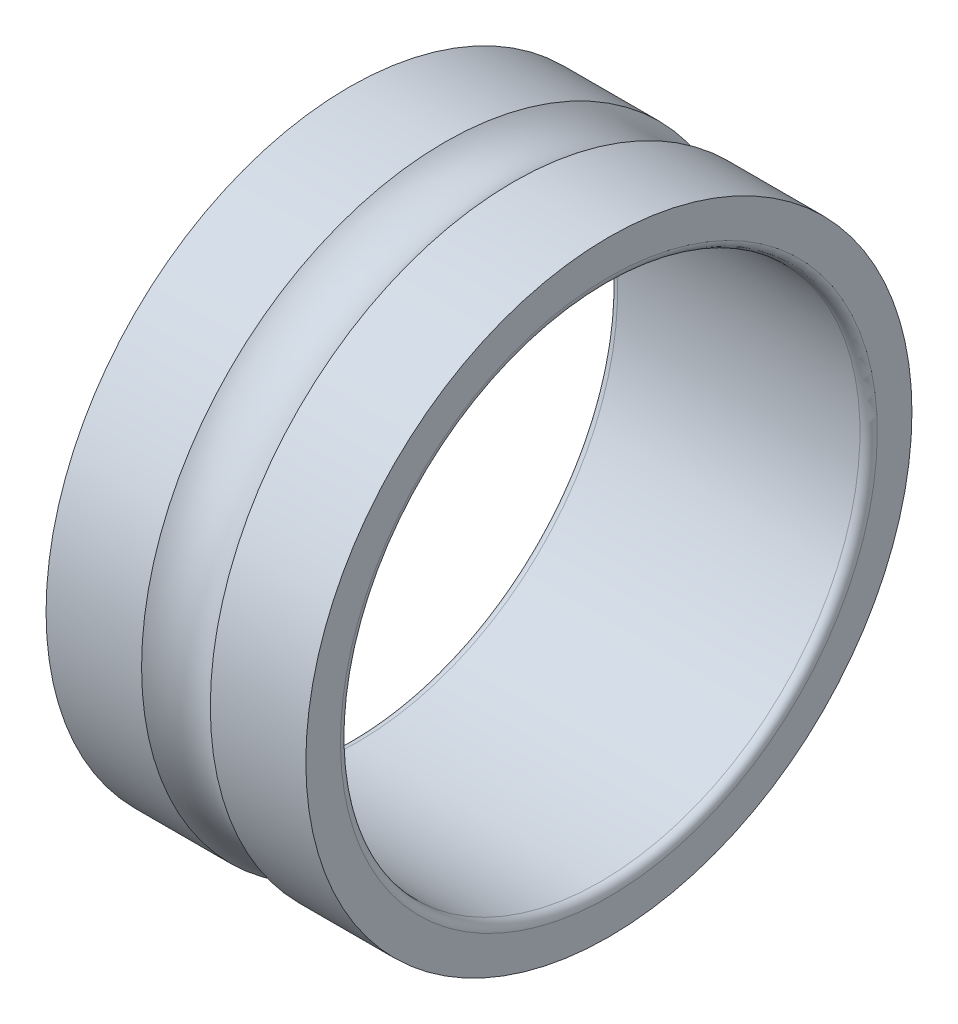
ISO-10303-21;
HEADER;
FILE_DESCRIPTION(('STEP AP214'),'2;1');
FILE_NAME('part.step','',(''),(''),'','','');
FILE_SCHEMA(('AUTOMOTIVE_DESIGN { 1 0 10303 214 1 1 1 1 }'));
ENDSEC;
DATA;
#1=APPLICATION_CONTEXT('core data for automotive mechanical design processes');
#2=APPLICATION_PROTOCOL_DEFINITION('international standard','automotive_design',2000,#1);
#3=PRODUCT_CONTEXT('',#1,'mechanical');
#4=PRODUCT('Part','Part','',(#3));
#5=PRODUCT_RELATED_PRODUCT_CATEGORY('part','',(#4));
#6=PRODUCT_DEFINITION_FORMATION('','',#4);
#7=PRODUCT_DEFINITION_CONTEXT('part definition',#1,'design');
#8=PRODUCT_DEFINITION('design','',#6,#7);
#9=PRODUCT_DEFINITION_SHAPE('','',#8);
#10=(LENGTH_UNIT() NAMED_UNIT(*) SI_UNIT(.MILLI.,.METRE.));
#11=(NAMED_UNIT(*) PLANE_ANGLE_UNIT() SI_UNIT($,.RADIAN.));
#12=(NAMED_UNIT(*) SI_UNIT($,.STERADIAN.) SOLID_ANGLE_UNIT());
#13=UNCERTAINTY_MEASURE_WITH_UNIT(LENGTH_MEASURE(1.E-05),#10,'distance_accuracy_value','');
#14=(GEOMETRIC_REPRESENTATION_CONTEXT(3) GLOBAL_UNCERTAINTY_ASSIGNED_CONTEXT((#13)) GLOBAL_UNIT_ASSIGNED_CONTEXT((#10,
#11,#12)) REPRESENTATION_CONTEXT('',''));
#15=CARTESIAN_POINT('',(0.,0.,0.));
#16=DIRECTION('',(0.,0.,1.));
#17=DIRECTION('',(1.,0.,0.));
#18=AXIS2_PLACEMENT_3D('',#15,#16,#17);
#19=CARTESIAN_POINT('',(2.44843134832985,0.,0.));
#20=DIRECTION('',(-1.,0.,0.));
#21=DIRECTION('',(0.,1.,0.));
#22=AXIS2_PLACEMENT_3D('',#19,#20,#21);
#23=CYLINDRICAL_SURFACE('',#22,3.5);
#24=CARTESIAN_POINT('',(1.89686269665969,0.,0.));
#25=DIRECTION('',(-1.,0.,0.));
#26=DIRECTION('',(0.,1.,0.));
#27=AXIS2_PLACEMENT_3D('',#24,#25,#26);
#28=CIRCLE('',#27,3.5);
#29=CARTESIAN_POINT('',(1.89686269665969,3.5,0.));
#30=VERTEX_POINT('',#29);
#31=EDGE_CURVE('E11',#30,#30,#28,.T.);
#32=ORIENTED_EDGE('',*,*,#31,.F.);
#33=EDGE_LOOP('',(#32));
#34=FACE_BOUND('',#33,.T.);
#35=CARTESIAN_POINT('',(3.,0.,0.));
#36=DIRECTION('',(-1.,0.,0.));
#37=DIRECTION('',(0.,1.,0.));
#38=AXIS2_PLACEMENT_3D('',#35,#36,#37);
#39=CIRCLE('',#38,3.5);
#40=CARTESIAN_POINT('',(3.,3.5,0.));
#41=VERTEX_POINT('',#40);
#42=EDGE_CURVE('E78',#41,#41,#39,.T.);
#43=ORIENTED_EDGE('',*,*,#42,.T.);
#44=EDGE_LOOP('',(#43));
#45=FACE_BOUND('',#44,.T.);
#46=ADVANCED_FACE('F37',(#34,#45),#23,.T.);
#47=CARTESIAN_POINT('',(1.5,0.,0.));
#48=DIRECTION('',(1.,0.,0.));
#49=DIRECTION('',(0.,0.,1.));
#50=AXIS2_PLACEMENT_3D('',#47,#48,#49);
#51=TOROIDAL_SURFACE('',#50,3.95,0.6);
#52=CARTESIAN_POINT('',(1.10313730334031,0.,0.));
#53=DIRECTION('',(-1.,0.,0.));
#54=DIRECTION('',(0.,1.,0.));
#55=AXIS2_PLACEMENT_3D('',#52,#53,#54);
#56=CIRCLE('',#55,3.5);
#57=CARTESIAN_POINT('',(1.10313730334031,3.5,0.));
#58=VERTEX_POINT('',#57);
#59=EDGE_CURVE('E46',#58,#58,#56,.T.);
#60=ORIENTED_EDGE('',*,*,#59,.F.);
#61=EDGE_LOOP('',(#60));
#62=FACE_BOUND('',#61,.T.);
#63=ORIENTED_EDGE('',*,*,#31,.T.);
#64=EDGE_LOOP('',(#63));
#65=FACE_BOUND('',#64,.T.);
#66=ADVANCED_FACE('F93',(#62,#65),#51,.F.);
#67=CARTESIAN_POINT('',(0.551568651670155,0.,0.));
#68=DIRECTION('',(-1.,0.,0.));
#69=DIRECTION('',(0.,1.,0.));
#70=AXIS2_PLACEMENT_3D('',#67,#68,#69);
#71=CYLINDRICAL_SURFACE('',#70,3.5);
#72=CARTESIAN_POINT('',(0.,0.,0.));
#73=DIRECTION('',(-1.,0.,0.));
#74=DIRECTION('',(0.,1.,0.));
#75=AXIS2_PLACEMENT_3D('',#72,#73,#74);
#76=CIRCLE('',#75,3.5);
#77=CARTESIAN_POINT('',(0.,3.5,0.));
#78=VERTEX_POINT('',#77);
#79=EDGE_CURVE('E85',#78,#78,#76,.T.);
#80=ORIENTED_EDGE('',*,*,#79,.F.);
#81=EDGE_LOOP('',(#80));
#82=FACE_BOUND('',#81,.T.);
#83=ORIENTED_EDGE('',*,*,#59,.T.);
#84=EDGE_LOOP('',(#83));
#85=FACE_BOUND('',#84,.T.);
#86=ADVANCED_FACE('F91',(#82,#85),#71,.T.);
#87=CARTESIAN_POINT('',(0.,3.3,0.));
#88=DIRECTION('',(-1.,0.,0.));
#89=DIRECTION('',(0.,-1.,0.));
#90=AXIS2_PLACEMENT_3D('',#87,#88,#89);
#91=PLANE('',#90);
#92=CARTESIAN_POINT('',(0.,0.,0.));
#93=DIRECTION('',(-1.,0.,0.));
#94=DIRECTION('',(0.,1.,0.));
#95=AXIS2_PLACEMENT_3D('',#92,#93,#94);
#96=CIRCLE('',#95,3.1);
#97=CARTESIAN_POINT('',(0.,3.1,0.));
#98=VERTEX_POINT('',#97);
#99=EDGE_CURVE('E67',#98,#98,#96,.T.);
#100=ORIENTED_EDGE('',*,*,#99,.F.);
#101=EDGE_LOOP('',(#100));
#102=FACE_BOUND('',#101,.T.);
#103=ORIENTED_EDGE('',*,*,#79,.T.);
#104=EDGE_LOOP('',(#103));
#105=FACE_BOUND('',#104,.T.);
#106=ADVANCED_FACE('F99',(#102,#105),#91,.T.);
#107=CARTESIAN_POINT('',(0.1,0.,0.));
#108=DIRECTION('',(1.,0.,0.));
#109=DIRECTION('',(0.,0.,1.));
#110=AXIS2_PLACEMENT_3D('',#107,#108,#109);
#111=TOROIDAL_SURFACE('',#110,3.1,0.1);
#112=CARTESIAN_POINT('',(0.1,0.,0.));
#113=DIRECTION('',(-1.,0.,0.));
#114=DIRECTION('',(0.,1.,0.));
#115=AXIS2_PLACEMENT_3D('',#112,#113,#114);
#116=CIRCLE('',#115,3.);
#117=CARTESIAN_POINT('',(0.1,3.,0.));
#118=VERTEX_POINT('',#117);
#119=EDGE_CURVE('E71',#118,#118,#116,.T.);
#120=ORIENTED_EDGE('',*,*,#119,.F.);
#121=EDGE_LOOP('',(#120));
#122=FACE_BOUND('',#121,.T.);
#123=ORIENTED_EDGE('',*,*,#99,.T.);
#124=EDGE_LOOP('',(#123));
#125=FACE_BOUND('',#124,.T.);
#126=ADVANCED_FACE('F105',(#122,#125),#111,.T.);
#127=CARTESIAN_POINT('',(1.5,0.,0.));
#128=DIRECTION('',(-1.,0.,0.));
#129=DIRECTION('',(0.,1.,0.));
#130=AXIS2_PLACEMENT_3D('',#127,#128,#129);
#131=CYLINDRICAL_SURFACE('',#130,3.);
#132=CARTESIAN_POINT('',(2.9,0.,0.));
#133=DIRECTION('',(-1.,0.,0.));
#134=DIRECTION('',(0.,1.,0.));
#135=AXIS2_PLACEMENT_3D('',#132,#133,#134);
#136=CIRCLE('',#135,3.);
#137=CARTESIAN_POINT('',(2.9,3.,0.));
#138=VERTEX_POINT('',#137);
#139=EDGE_CURVE('E75',#138,#138,#136,.T.);
#140=ORIENTED_EDGE('',*,*,#139,.F.);
#141=EDGE_LOOP('',(#140));
#142=FACE_BOUND('',#141,.T.);
#143=ORIENTED_EDGE('',*,*,#119,.T.);
#144=EDGE_LOOP('',(#143));
#145=FACE_BOUND('',#144,.T.);
#146=ADVANCED_FACE('F108',(#142,#145),#131,.F.);
#147=CARTESIAN_POINT('',(2.9,0.,0.));
#148=DIRECTION('',(1.,0.,0.));
#149=DIRECTION('',(0.,0.,1.));
#150=AXIS2_PLACEMENT_3D('',#147,#148,#149);
#151=TOROIDAL_SURFACE('',#150,3.1,0.1);
#152=CARTESIAN_POINT('',(3.,0.,0.));
#153=DIRECTION('',(-1.,0.,0.));
#154=DIRECTION('',(0.,1.,0.));
#155=AXIS2_PLACEMENT_3D('',#152,#153,#154);
#156=CIRCLE('',#155,3.1);
#157=CARTESIAN_POINT('',(3.,3.1,0.));
#158=VERTEX_POINT('',#157);
#159=EDGE_CURVE('E81',#158,#158,#156,.T.);
#160=ORIENTED_EDGE('',*,*,#159,.F.);
#161=EDGE_LOOP('',(#160));
#162=FACE_BOUND('',#161,.T.);
#163=ORIENTED_EDGE('',*,*,#139,.T.);
#164=EDGE_LOOP('',(#163));
#165=FACE_BOUND('',#164,.T.);
#166=ADVANCED_FACE('F76',(#162,#165),#151,.T.);
#167=CARTESIAN_POINT('',(3.,3.3,0.));
#168=DIRECTION('',(1.,0.,0.));
#169=DIRECTION('',(0.,1.,0.));
#170=AXIS2_PLACEMENT_3D('',#167,#168,#169);
#171=PLANE('',#170);
#172=ORIENTED_EDGE('',*,*,#42,.F.);
#173=EDGE_LOOP('',(#172));
#174=FACE_BOUND('',#173,.T.);
#175=ORIENTED_EDGE('',*,*,#159,.T.);
#176=EDGE_LOOP('',(#175));
#177=FACE_BOUND('',#176,.T.);
#178=ADVANCED_FACE('F39',(#174,#177),#171,.T.);
#179=CLOSED_SHELL('',(#46,#66,#86,#106,#126,#146,#166,#178));
#180=MANIFOLD_SOLID_BREP('B2',#179);
#181=ADVANCED_BREP_SHAPE_REPRESENTATION('',(#18,#180),#14);
#182=SHAPE_DEFINITION_REPRESENTATION(#9,#181);
ENDSEC;
END-ISO-10303-21;
